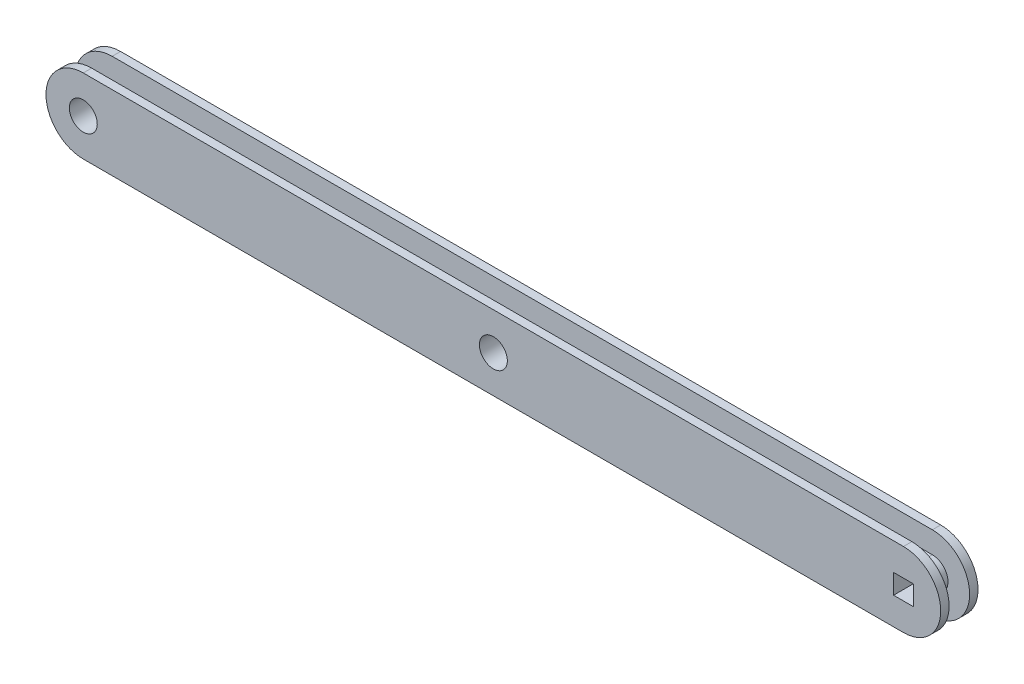
ISO-10303-21;
HEADER;
FILE_DESCRIPTION(('STEP AP214'),'2;1');
FILE_NAME('part.step','',(''),(''),'','','');
FILE_SCHEMA(('AUTOMOTIVE_DESIGN { 1 0 10303 214 1 1 1 1 }'));
ENDSEC;
DATA;
#1=APPLICATION_CONTEXT('core data for automotive mechanical design processes');
#2=APPLICATION_PROTOCOL_DEFINITION('international standard','automotive_design',2000,#1);
#3=PRODUCT_CONTEXT('',#1,'mechanical');
#4=PRODUCT('Part','Part','',(#3));
#5=PRODUCT_RELATED_PRODUCT_CATEGORY('part','',(#4));
#6=PRODUCT_DEFINITION_FORMATION('','',#4);
#7=PRODUCT_DEFINITION_CONTEXT('part definition',#1,'design');
#8=PRODUCT_DEFINITION('design','',#6,#7);
#9=PRODUCT_DEFINITION_SHAPE('','',#8);
#10=(LENGTH_UNIT() NAMED_UNIT(*) SI_UNIT(.MILLI.,.METRE.));
#11=(NAMED_UNIT(*) PLANE_ANGLE_UNIT() SI_UNIT($,.RADIAN.));
#12=(NAMED_UNIT(*) SI_UNIT($,.STERADIAN.) SOLID_ANGLE_UNIT());
#13=UNCERTAINTY_MEASURE_WITH_UNIT(LENGTH_MEASURE(1.E-05),#10,'distance_accuracy_value','');
#14=(GEOMETRIC_REPRESENTATION_CONTEXT(3) GLOBAL_UNCERTAINTY_ASSIGNED_CONTEXT((#13)) GLOBAL_UNIT_ASSIGNED_CONTEXT((#10,
#11,#12)) REPRESENTATION_CONTEXT('',''));
#15=CARTESIAN_POINT('',(0.,0.,0.));
#16=DIRECTION('',(0.,0.,1.));
#17=DIRECTION('',(1.,0.,0.));
#18=AXIS2_PLACEMENT_3D('',#15,#16,#17);
#19=CARTESIAN_POINT('',(0.,0.,-6.35));
#20=DIRECTION('',(0.,-1.,0.));
#21=DIRECTION('',(1.,0.,0.));
#22=AXIS2_PLACEMENT_3D('',#19,#20,#21);
#23=PLANE('',#22);
#24=DIRECTION('',(0.,0.,1.));
#25=VECTOR('',#24,1.);
#26=CARTESIAN_POINT('',(-146.05,0.,-6.35));
#27=LINE('',#26,#25);
#28=CARTESIAN_POINT('',(-146.05,0.,-1.427499939));
#29=VERTEX_POINT('',#28);
#30=CARTESIAN_POINT('',(-146.05,0.,0.));
#31=VERTEX_POINT('',#30);
#32=EDGE_CURVE('E436',#29,#31,#27,.T.);
#33=ORIENTED_EDGE('',*,*,#32,.F.);
#34=DIRECTION('',(1.,0.,0.));
#35=VECTOR('',#34,1.);
#36=CARTESIAN_POINT('',(-152.4,0.,-1.427499939));
#37=LINE('',#36,#35);
#38=CARTESIAN_POINT('',(-6.35000000000005,0.,-1.427499939));
#39=VERTEX_POINT('',#38);
#40=EDGE_CURVE('E420',#29,#39,#37,.T.);
#41=ORIENTED_EDGE('',*,*,#40,.T.);
#42=DIRECTION('',(0.,0.,1.));
#43=VECTOR('',#42,1.);
#44=CARTESIAN_POINT('',(-6.34999999999999,0.,-6.35));
#45=LINE('',#44,#43);
#46=CARTESIAN_POINT('',(-6.34999999999999,0.,0.));
#47=VERTEX_POINT('',#46);
#48=EDGE_CURVE('E451',#39,#47,#45,.T.);
#49=ORIENTED_EDGE('',*,*,#48,.T.);
#50=DIRECTION('',(1.,0.,0.));
#51=VECTOR('',#50,1.);
#52=CARTESIAN_POINT('',(0.,0.,0.));
#53=LINE('',#52,#51);
#54=EDGE_CURVE('E500',#31,#47,#53,.T.);
#55=ORIENTED_EDGE('',*,*,#54,.F.);
#56=EDGE_LOOP('',(#33,#41,#49,#55));
#57=FACE_BOUND('',#56,.T.);
#58=ADVANCED_FACE('F296',(#57),#23,.T.);
#59=CARTESIAN_POINT('',(-6.34999999999999,0.,-6.35));
#60=VERTEX_POINT('',#59);
#61=CARTESIAN_POINT('',(-6.35000000000005,0.,-4.922500061));
#62=VERTEX_POINT('',#61);
#63=EDGE_CURVE('E416',#60,#62,#45,.T.);
#64=ORIENTED_EDGE('',*,*,#63,.T.);
#65=DIRECTION('',(1.,0.,0.));
#66=VECTOR('',#65,1.);
#67=CARTESIAN_POINT('',(-152.4,0.,-4.922500061));
#68=LINE('',#67,#66);
#69=CARTESIAN_POINT('',(-146.05,0.,-4.922500061));
#70=VERTEX_POINT('',#69);
#71=EDGE_CURVE('E409',#70,#62,#68,.T.);
#72=ORIENTED_EDGE('',*,*,#71,.F.);
#73=CARTESIAN_POINT('',(-146.05,0.,-6.35));
#74=VERTEX_POINT('',#73);
#75=EDGE_CURVE('E413',#74,#70,#27,.T.);
#76=ORIENTED_EDGE('',*,*,#75,.F.);
#77=DIRECTION('',(1.,0.,0.));
#78=VECTOR('',#77,1.);
#79=CARTESIAN_POINT('',(0.,0.,-6.35));
#80=LINE('',#79,#78);
#81=EDGE_CURVE('E499',#74,#60,#80,.T.);
#82=ORIENTED_EDGE('',*,*,#81,.T.);
#83=EDGE_LOOP('',(#64,#72,#76,#82));
#84=FACE_BOUND('',#83,.T.);
#85=ADVANCED_FACE('F411',(#84),#23,.T.);
#86=CARTESIAN_POINT('',(-152.4,12.7,-6.35));
#87=DIRECTION('',(0.,1.,0.));
#88=DIRECTION('',(-1.,0.,0.));
#89=AXIS2_PLACEMENT_3D('',#86,#87,#88);
#90=PLANE('',#89);
#91=DIRECTION('',(1.,0.,0.));
#92=VECTOR('',#91,1.);
#93=CARTESIAN_POINT('',(-152.4,12.7,-1.427499939));
#94=LINE('',#93,#92);
#95=CARTESIAN_POINT('',(-146.05,12.7,-1.427499939));
#96=VERTEX_POINT('',#95);
#97=CARTESIAN_POINT('',(-6.35000000000008,12.7,-1.427499939));
#98=VERTEX_POINT('',#97);
#99=EDGE_CURVE('E513',#96,#98,#94,.T.);
#100=ORIENTED_EDGE('',*,*,#99,.F.);
#101=DIRECTION('',(0.,0.,1.));
#102=VECTOR('',#101,1.);
#103=CARTESIAN_POINT('',(-146.05,12.7,-6.35));
#104=LINE('',#103,#102);
#105=CARTESIAN_POINT('',(-146.05,12.7,0.));
#106=VERTEX_POINT('',#105);
#107=EDGE_CURVE('E444',#96,#106,#104,.T.);
#108=ORIENTED_EDGE('',*,*,#107,.T.);
#109=DIRECTION('',(-1.,0.,0.));
#110=VECTOR('',#109,1.);
#111=CARTESIAN_POINT('',(-152.4,12.7,0.));
#112=LINE('',#111,#110);
#113=CARTESIAN_POINT('',(-6.35,12.7,0.));
#114=VERTEX_POINT('',#113);
#115=EDGE_CURVE('E480',#114,#106,#112,.T.);
#116=ORIENTED_EDGE('',*,*,#115,.F.);
#117=DIRECTION('',(0.,0.,1.));
#118=VECTOR('',#117,1.);
#119=CARTESIAN_POINT('',(-6.35,12.7,-6.35));
#120=LINE('',#119,#118);
#121=EDGE_CURVE('E435',#98,#114,#120,.T.);
#122=ORIENTED_EDGE('',*,*,#121,.F.);
#123=EDGE_LOOP('',(#100,#108,#116,#122));
#124=FACE_BOUND('',#123,.T.);
#125=ADVANCED_FACE('F527',(#124),#90,.T.);
#126=CARTESIAN_POINT('',(-6.35,6.34999999999998,-6.35));
#127=DIRECTION('',(0.,0.,1.));
#128=DIRECTION('',(1.,0.,0.));
#129=AXIS2_PLACEMENT_3D('',#126,#127,#128);
#130=CYLINDRICAL_SURFACE('',#129,6.35);
#131=CARTESIAN_POINT('',(-6.35,6.34999999999998,-4.922500061));
#132=DIRECTION('',(0.,0.,1.));
#133=DIRECTION('',(1.,0.,0.));
#134=AXIS2_PLACEMENT_3D('',#131,#132,#133);
#135=CIRCLE('',#134,6.35);
#136=CARTESIAN_POINT('',(-6.35000000000008,12.7,-4.922500061));
#137=VERTEX_POINT('',#136);
#138=EDGE_CURVE('E12',#62,#137,#135,.T.);
#139=ORIENTED_EDGE('',*,*,#138,.F.);
#140=ORIENTED_EDGE('',*,*,#63,.F.);
#141=CARTESIAN_POINT('',(-6.35,6.34999999999998,-6.35));
#142=DIRECTION('',(0.,0.,1.));
#143=DIRECTION('',(1.,0.,0.));
#144=AXIS2_PLACEMENT_3D('',#141,#142,#143);
#145=CIRCLE('',#144,6.35);
#146=CARTESIAN_POINT('',(-6.35,12.7,-6.35));
#147=VERTEX_POINT('',#146);
#148=EDGE_CURVE('E492',#147,#60,#145,.F.);
#149=ORIENTED_EDGE('',*,*,#148,.F.);
#150=EDGE_CURVE('E438',#147,#137,#120,.T.);
#151=ORIENTED_EDGE('',*,*,#150,.T.);
#152=EDGE_LOOP('',(#139,#140,#149,#151));
#153=FACE_BOUND('',#152,.T.);
#154=ADVANCED_FACE('F553',(#153),#130,.T.);
#155=CARTESIAN_POINT('',(-6.35,6.34999999999998,-1.427499939));
#156=DIRECTION('',(0.,0.,-1.));
#157=DIRECTION('',(-1.,0.,0.));
#158=AXIS2_PLACEMENT_3D('',#155,#156,#157);
#159=CIRCLE('',#158,6.35);
#160=EDGE_CURVE('E304',#98,#39,#159,.T.);
#161=ORIENTED_EDGE('',*,*,#160,.F.);
#162=ORIENTED_EDGE('',*,*,#121,.T.);
#163=CARTESIAN_POINT('',(-6.35,6.34999999999998,0.));
#164=DIRECTION('',(0.,0.,1.));
#165=DIRECTION('',(1.,0.,0.));
#166=AXIS2_PLACEMENT_3D('',#163,#164,#165);
#167=CIRCLE('',#166,6.35);
#168=EDGE_CURVE('E490',#114,#47,#167,.F.);
#169=ORIENTED_EDGE('',*,*,#168,.T.);
#170=ORIENTED_EDGE('',*,*,#48,.F.);
#171=EDGE_LOOP('',(#161,#162,#169,#170));
#172=FACE_BOUND('',#171,.T.);
#173=ADVANCED_FACE('F520',(#172),#130,.T.);
#174=CARTESIAN_POINT('',(-146.05,6.34999999999998,-6.35));
#175=DIRECTION('',(0.,0.,1.));
#176=DIRECTION('',(1.,0.,0.));
#177=AXIS2_PLACEMENT_3D('',#174,#175,#176);
#178=CYLINDRICAL_SURFACE('',#177,6.35);
#179=ORIENTED_EDGE('',*,*,#75,.T.);
#180=CARTESIAN_POINT('',(-146.05,6.34999999999998,-4.922500061));
#181=DIRECTION('',(0.,0.,1.));
#182=DIRECTION('',(1.,0.,0.));
#183=AXIS2_PLACEMENT_3D('',#180,#181,#182);
#184=CIRCLE('',#183,6.35);
#185=CARTESIAN_POINT('',(-146.05,12.7,-4.922500061));
#186=VERTEX_POINT('',#185);
#187=EDGE_CURVE('E423',#70,#186,#184,.F.);
#188=ORIENTED_EDGE('',*,*,#187,.T.);
#189=CARTESIAN_POINT('',(-146.05,12.7,-6.35));
#190=VERTEX_POINT('',#189);
#191=EDGE_CURVE('E449',#190,#186,#104,.T.);
#192=ORIENTED_EDGE('',*,*,#191,.F.);
#193=CARTESIAN_POINT('',(-146.05,6.34999999999998,-6.35));
#194=DIRECTION('',(0.,0.,1.));
#195=DIRECTION('',(1.,0.,0.));
#196=AXIS2_PLACEMENT_3D('',#193,#194,#195);
#197=CIRCLE('',#196,6.35);
#198=EDGE_CURVE('E434',#190,#74,#197,.T.);
#199=ORIENTED_EDGE('',*,*,#198,.T.);
#200=EDGE_LOOP('',(#179,#188,#192,#199));
#201=FACE_BOUND('',#200,.T.);
#202=ADVANCED_FACE('F432',(#201),#178,.T.);
#203=ORIENTED_EDGE('',*,*,#107,.F.);
#204=CARTESIAN_POINT('',(-146.05,6.34999999999998,-1.427499939));
#205=DIRECTION('',(0.,0.,-1.));
#206=DIRECTION('',(-1.,0.,0.));
#207=AXIS2_PLACEMENT_3D('',#204,#205,#206);
#208=CIRCLE('',#207,6.35);
#209=EDGE_CURVE('E430',#96,#29,#208,.F.);
#210=ORIENTED_EDGE('',*,*,#209,.T.);
#211=ORIENTED_EDGE('',*,*,#32,.T.);
#212=CARTESIAN_POINT('',(-146.05,6.34999999999998,0.));
#213=DIRECTION('',(0.,0.,1.));
#214=DIRECTION('',(1.,0.,0.));
#215=AXIS2_PLACEMENT_3D('',#212,#213,#214);
#216=CIRCLE('',#215,6.35);
#217=EDGE_CURVE('E445',#106,#31,#216,.T.);
#218=ORIENTED_EDGE('',*,*,#217,.F.);
#219=EDGE_LOOP('',(#203,#210,#211,#218));
#220=FACE_BOUND('',#219,.T.);
#221=ADVANCED_FACE('F530',(#220),#178,.T.);
#222=DIRECTION('',(1.,0.,0.));
#223=VECTOR('',#222,1.);
#224=CARTESIAN_POINT('',(-152.4,12.7,-4.922500061));
#225=LINE('',#224,#223);
#226=EDGE_CURVE('E426',#186,#137,#225,.T.);
#227=ORIENTED_EDGE('',*,*,#226,.T.);
#228=ORIENTED_EDGE('',*,*,#150,.F.);
#229=DIRECTION('',(-1.,0.,0.));
#230=VECTOR('',#229,1.);
#231=CARTESIAN_POINT('',(-152.4,12.7,-6.35));
#232=LINE('',#231,#230);
#233=EDGE_CURVE('E497',#147,#190,#232,.T.);
#234=ORIENTED_EDGE('',*,*,#233,.T.);
#235=ORIENTED_EDGE('',*,*,#191,.T.);
#236=EDGE_LOOP('',(#227,#228,#234,#235));
#237=FACE_BOUND('',#236,.T.);
#238=ADVANCED_FACE('F298',(#237),#90,.T.);
#239=CARTESIAN_POINT('',(0.,0.,-6.35));
#240=DIRECTION('',(0.,0.,-1.));
#241=DIRECTION('',(-1.,0.,0.));
#242=AXIS2_PLACEMENT_3D('',#239,#240,#241);
#243=PLANE('',#242);
#244=ORIENTED_EDGE('',*,*,#233,.F.);
#245=ORIENTED_EDGE('',*,*,#148,.T.);
#246=ORIENTED_EDGE('',*,*,#81,.F.);
#247=ORIENTED_EDGE('',*,*,#198,.F.);
#248=EDGE_LOOP('',(#244,#245,#246,#247));
#249=FACE_BOUND('',#248,.T.);
#250=CARTESIAN_POINT('',(-76.2,6.34999999999998,-6.35));
#251=DIRECTION('',(0.,0.,1.));
#252=DIRECTION('',(1.,0.,0.));
#253=AXIS2_PLACEMENT_3D('',#250,#251,#252);
#254=CIRCLE('',#253,2.38125000000001);
#255=CARTESIAN_POINT('',(-73.81875,6.34999999999998,-6.35));
#256=VERTEX_POINT('',#255);
#257=EDGE_CURVE('E487',#256,#256,#254,.T.);
#258=ORIENTED_EDGE('',*,*,#257,.T.);
#259=EDGE_LOOP('',(#258));
#260=FACE_BOUND('',#259,.T.);
#261=CARTESIAN_POINT('',(-146.05,6.34999999999998,-6.35));
#262=DIRECTION('',(0.,0.,1.));
#263=DIRECTION('',(1.,0.,0.));
#264=AXIS2_PLACEMENT_3D('',#261,#262,#263);
#265=CIRCLE('',#264,2.38125000000001);
#266=CARTESIAN_POINT('',(-143.66875,6.34999999999998,-6.35));
#267=VERTEX_POINT('',#266);
#268=EDGE_CURVE('E477',#267,#267,#265,.T.);
#269=ORIENTED_EDGE('',*,*,#268,.T.);
#270=EDGE_LOOP('',(#269));
#271=FACE_BOUND('',#270,.T.);
#272=DIRECTION('',(1.,0.,0.));
#273=VECTOR('',#272,1.);
#274=CARTESIAN_POINT('',(0.,8.03379802270045,-6.35));
#275=LINE('',#274,#273);
#276=CARTESIAN_POINT('',(-8.03379802270047,8.03379802270045,-6.35));
#277=VERTEX_POINT('',#276);
#278=CARTESIAN_POINT('',(-4.66620197729953,8.03379802270045,-6.35));
#279=VERTEX_POINT('',#278);
#280=EDGE_CURVE('E472',#277,#279,#275,.T.);
#281=ORIENTED_EDGE('',*,*,#280,.F.);
#282=DIRECTION('',(0.,1.,0.));
#283=VECTOR('',#282,1.);
#284=CARTESIAN_POINT('',(-8.03379802270047,0.,-6.35));
#285=LINE('',#284,#283);
#286=CARTESIAN_POINT('',(-8.03379802270047,4.66620197729952,-6.35));
#287=VERTEX_POINT('',#286);
#288=EDGE_CURVE('E454',#287,#277,#285,.T.);
#289=ORIENTED_EDGE('',*,*,#288,.F.);
#290=DIRECTION('',(1.,0.,0.));
#291=VECTOR('',#290,1.);
#292=CARTESIAN_POINT('',(0.,4.66620197729952,-6.35));
#293=LINE('',#292,#291);
#294=CARTESIAN_POINT('',(-4.66620197729953,4.66620197729952,-6.35));
#295=VERTEX_POINT('',#294);
#296=EDGE_CURVE('E463',#287,#295,#293,.T.);
#297=ORIENTED_EDGE('',*,*,#296,.T.);
#298=DIRECTION('',(0.,1.,0.));
#299=VECTOR('',#298,1.);
#300=CARTESIAN_POINT('',(-4.66620197729953,0.,-6.35));
#301=LINE('',#300,#299);
#302=EDGE_CURVE('E311',#295,#279,#301,.T.);
#303=ORIENTED_EDGE('',*,*,#302,.T.);
#304=EDGE_LOOP('',(#281,#289,#297,#303));
#305=FACE_BOUND('',#304,.T.);
#306=ADVANCED_FACE('F537',(#249,#260,#271,#305),#243,.T.);
#307=CARTESIAN_POINT('',(0.,0.,0.));
#308=DIRECTION('',(0.,0.,-1.));
#309=DIRECTION('',(-1.,0.,0.));
#310=AXIS2_PLACEMENT_3D('',#307,#308,#309);
#311=PLANE('',#310);
#312=DIRECTION('',(0.,1.,0.));
#313=VECTOR('',#312,1.);
#314=CARTESIAN_POINT('',(-8.03379802270047,0.,0.));
#315=LINE('',#314,#313);
#316=CARTESIAN_POINT('',(-8.03379802270047,4.66620197729952,0.));
#317=VERTEX_POINT('',#316);
#318=CARTESIAN_POINT('',(-8.03379802270047,8.03379802270045,0.));
#319=VERTEX_POINT('',#318);
#320=EDGE_CURVE('E319',#317,#319,#315,.T.);
#321=ORIENTED_EDGE('',*,*,#320,.T.);
#322=DIRECTION('',(1.,0.,0.));
#323=VECTOR('',#322,1.);
#324=CARTESIAN_POINT('',(0.,8.03379802270045,0.));
#325=LINE('',#324,#323);
#326=CARTESIAN_POINT('',(-4.66620197729953,8.03379802270045,0.));
#327=VERTEX_POINT('',#326);
#328=EDGE_CURVE('E462',#319,#327,#325,.T.);
#329=ORIENTED_EDGE('',*,*,#328,.T.);
#330=DIRECTION('',(0.,1.,0.));
#331=VECTOR('',#330,1.);
#332=CARTESIAN_POINT('',(-4.66620197729953,0.,0.));
#333=LINE('',#332,#331);
#334=CARTESIAN_POINT('',(-4.66620197729953,4.66620197729952,0.));
#335=VERTEX_POINT('',#334);
#336=EDGE_CURVE('E466',#335,#327,#333,.T.);
#337=ORIENTED_EDGE('',*,*,#336,.F.);
#338=DIRECTION('',(1.,0.,0.));
#339=VECTOR('',#338,1.);
#340=CARTESIAN_POINT('',(0.,4.66620197729952,0.));
#341=LINE('',#340,#339);
#342=EDGE_CURVE('E448',#317,#335,#341,.T.);
#343=ORIENTED_EDGE('',*,*,#342,.F.);
#344=EDGE_LOOP('',(#321,#329,#337,#343));
#345=FACE_BOUND('',#344,.T.);
#346=CARTESIAN_POINT('',(-146.05,6.34999999999998,0.));
#347=DIRECTION('',(0.,0.,1.));
#348=DIRECTION('',(1.,0.,0.));
#349=AXIS2_PLACEMENT_3D('',#346,#347,#348);
#350=CIRCLE('',#349,2.38125000000001);
#351=CARTESIAN_POINT('',(-143.66875,6.34999999999998,0.));
#352=VERTEX_POINT('',#351);
#353=EDGE_CURVE('E481',#352,#352,#350,.T.);
#354=ORIENTED_EDGE('',*,*,#353,.F.);
#355=EDGE_LOOP('',(#354));
#356=FACE_BOUND('',#355,.T.);
#357=CARTESIAN_POINT('',(-76.2,6.34999999999998,0.));
#358=DIRECTION('',(0.,0.,1.));
#359=DIRECTION('',(1.,0.,0.));
#360=AXIS2_PLACEMENT_3D('',#357,#358,#359);
#361=CIRCLE('',#360,2.38125000000001);
#362=CARTESIAN_POINT('',(-73.81875,6.34999999999998,0.));
#363=VERTEX_POINT('',#362);
#364=EDGE_CURVE('E484',#363,#363,#361,.T.);
#365=ORIENTED_EDGE('',*,*,#364,.F.);
#366=EDGE_LOOP('',(#365));
#367=FACE_BOUND('',#366,.T.);
#368=ORIENTED_EDGE('',*,*,#168,.F.);
#369=ORIENTED_EDGE('',*,*,#115,.T.);
#370=ORIENTED_EDGE('',*,*,#217,.T.);
#371=ORIENTED_EDGE('',*,*,#54,.T.);
#372=EDGE_LOOP('',(#368,#369,#370,#371));
#373=FACE_BOUND('',#372,.T.);
#374=ADVANCED_FACE('F524',(#345,#356,#367,#373),#311,.F.);
#375=CARTESIAN_POINT('',(-146.05,6.34999999999998,-6.35));
#376=DIRECTION('',(0.,0.,1.));
#377=DIRECTION('',(1.,0.,0.));
#378=AXIS2_PLACEMENT_3D('',#375,#376,#377);
#379=CYLINDRICAL_SURFACE('',#378,2.38125000000001);
#380=ORIENTED_EDGE('',*,*,#268,.F.);
#381=EDGE_LOOP('',(#380));
#382=FACE_BOUND('',#381,.T.);
#383=ORIENTED_EDGE('',*,*,#353,.T.);
#384=EDGE_LOOP('',(#383));
#385=FACE_BOUND('',#384,.T.);
#386=ADVANCED_FACE('F548',(#382,#385),#379,.F.);
#387=CARTESIAN_POINT('',(-76.2,6.34999999999998,-6.35));
#388=DIRECTION('',(0.,0.,1.));
#389=DIRECTION('',(1.,0.,0.));
#390=AXIS2_PLACEMENT_3D('',#387,#388,#389);
#391=CYLINDRICAL_SURFACE('',#390,2.38125000000001);
#392=ORIENTED_EDGE('',*,*,#257,.F.);
#393=EDGE_LOOP('',(#392));
#394=FACE_BOUND('',#393,.T.);
#395=ORIENTED_EDGE('',*,*,#364,.T.);
#396=EDGE_LOOP('',(#395));
#397=FACE_BOUND('',#396,.T.);
#398=ADVANCED_FACE('F557',(#394,#397),#391,.F.);
#399=CARTESIAN_POINT('',(-8.03379802270047,0.,-6.35));
#400=DIRECTION('',(1.,0.,0.));
#401=DIRECTION('',(0.,0.,-1.));
#402=AXIS2_PLACEMENT_3D('',#399,#400,#401);
#403=PLANE('',#402);
#404=ORIENTED_EDGE('',*,*,#320,.F.);
#405=DIRECTION('',(0.,0.,1.));
#406=VECTOR('',#405,1.);
#407=CARTESIAN_POINT('',(-8.03379802270047,4.66620197729952,-6.35));
#408=LINE('',#407,#406);
#409=EDGE_CURVE('E459',#287,#317,#408,.T.);
#410=ORIENTED_EDGE('',*,*,#409,.F.);
#411=ORIENTED_EDGE('',*,*,#288,.T.);
#412=DIRECTION('',(0.,0.,1.));
#413=VECTOR('',#412,1.);
#414=CARTESIAN_POINT('',(-8.03379802270047,8.03379802270045,-6.35));
#415=LINE('',#414,#413);
#416=EDGE_CURVE('E457',#277,#319,#415,.T.);
#417=ORIENTED_EDGE('',*,*,#416,.T.);
#418=EDGE_LOOP('',(#404,#410,#411,#417));
#419=FACE_BOUND('',#418,.T.);
#420=ADVANCED_FACE('F560',(#419),#403,.T.);
#421=CARTESIAN_POINT('',(0.,8.03379802270045,-6.35));
#422=DIRECTION('',(0.,-1.,0.));
#423=DIRECTION('',(0.,0.,-1.));
#424=AXIS2_PLACEMENT_3D('',#421,#422,#423);
#425=PLANE('',#424);
#426=ORIENTED_EDGE('',*,*,#328,.F.);
#427=ORIENTED_EDGE('',*,*,#416,.F.);
#428=ORIENTED_EDGE('',*,*,#280,.T.);
#429=DIRECTION('',(0.,0.,1.));
#430=VECTOR('',#429,1.);
#431=CARTESIAN_POINT('',(-4.66620197729953,8.03379802270045,-6.35));
#432=LINE('',#431,#430);
#433=EDGE_CURVE('E455',#279,#327,#432,.T.);
#434=ORIENTED_EDGE('',*,*,#433,.T.);
#435=EDGE_LOOP('',(#426,#427,#428,#434));
#436=FACE_BOUND('',#435,.T.);
#437=ADVANCED_FACE('F567',(#436),#425,.T.);
#438=CARTESIAN_POINT('',(-4.66620197729953,0.,-6.35));
#439=DIRECTION('',(1.,0.,0.));
#440=DIRECTION('',(0.,0.,-1.));
#441=AXIS2_PLACEMENT_3D('',#438,#439,#440);
#442=PLANE('',#441);
#443=ORIENTED_EDGE('',*,*,#336,.T.);
#444=ORIENTED_EDGE('',*,*,#433,.F.);
#445=ORIENTED_EDGE('',*,*,#302,.F.);
#446=DIRECTION('',(0.,0.,1.));
#447=VECTOR('',#446,1.);
#448=CARTESIAN_POINT('',(-4.66620197729953,4.66620197729952,-6.35));
#449=LINE('',#448,#447);
#450=EDGE_CURVE('E452',#295,#335,#449,.T.);
#451=ORIENTED_EDGE('',*,*,#450,.T.);
#452=EDGE_LOOP('',(#443,#444,#445,#451));
#453=FACE_BOUND('',#452,.T.);
#454=ADVANCED_FACE('F570',(#453),#442,.F.);
#455=CARTESIAN_POINT('',(0.,4.66620197729952,-6.35));
#456=DIRECTION('',(0.,-1.,0.));
#457=DIRECTION('',(0.,0.,-1.));
#458=AXIS2_PLACEMENT_3D('',#455,#456,#457);
#459=PLANE('',#458);
#460=ORIENTED_EDGE('',*,*,#342,.T.);
#461=ORIENTED_EDGE('',*,*,#450,.F.);
#462=ORIENTED_EDGE('',*,*,#296,.F.);
#463=ORIENTED_EDGE('',*,*,#409,.T.);
#464=EDGE_LOOP('',(#460,#461,#462,#463));
#465=FACE_BOUND('',#464,.T.);
#466=ADVANCED_FACE('F573',(#465),#459,.F.);
#467=CARTESIAN_POINT('',(-146.050000000001,152.4,-4.922500061));
#468=DIRECTION('',(0.,0.,1.));
#469=DIRECTION('',(1.,0.,0.));
#470=AXIS2_PLACEMENT_3D('',#467,#468,#469);
#471=PLANE('',#470);
#472=DIRECTION('',(1.,0.,0.));
#473=VECTOR('',#472,1.);
#474=CARTESIAN_POINT('',(-152.4,3.68299999999997,-4.922500061));
#475=LINE('',#474,#473);
#476=CARTESIAN_POINT('',(-146.05,3.68299999999997,-4.922500061));
#477=VERTEX_POINT('',#476);
#478=CARTESIAN_POINT('',(-6.34999999999999,3.68299999999997,-4.922500061));
#479=VERTEX_POINT('',#478);
#480=EDGE_CURVE('E419',#477,#479,#475,.T.);
#481=ORIENTED_EDGE('',*,*,#480,.F.);
#482=CARTESIAN_POINT('',(-146.05,6.34999999999999,-4.922500061));
#483=DIRECTION('',(0.,0.,-1.));
#484=DIRECTION('',(-1.,0.,0.));
#485=AXIS2_PLACEMENT_3D('',#482,#483,#484);
#486=CIRCLE('',#485,2.66700000000001);
#487=CARTESIAN_POINT('',(-146.05,9.017,-4.922500061));
#488=VERTEX_POINT('',#487);
#489=EDGE_CURVE('E615',#477,#488,#486,.T.);
#490=ORIENTED_EDGE('',*,*,#489,.T.);
#491=DIRECTION('',(1.,0.,0.));
#492=VECTOR('',#491,1.);
#493=CARTESIAN_POINT('',(-152.4,9.017,-4.922500061));
#494=LINE('',#493,#492);
#495=CARTESIAN_POINT('',(-6.35000000000005,9.017,-4.922500061));
#496=VERTEX_POINT('',#495);
#497=EDGE_CURVE('E637',#488,#496,#494,.T.);
#498=ORIENTED_EDGE('',*,*,#497,.T.);
#499=CARTESIAN_POINT('',(-6.34999999999999,6.34999999999999,-4.922500061));
#500=DIRECTION('',(0.,0.,1.));
#501=DIRECTION('',(1.,0.,0.));
#502=AXIS2_PLACEMENT_3D('',#499,#500,#501);
#503=CIRCLE('',#502,2.66700000000001);
#504=EDGE_CURVE('E627',#479,#496,#503,.T.);
#505=ORIENTED_EDGE('',*,*,#504,.F.);
#506=EDGE_LOOP('',(#481,#490,#498,#505));
#507=FACE_BOUND('',#506,.T.);
#508=ORIENTED_EDGE('',*,*,#138,.T.);
#509=ORIENTED_EDGE('',*,*,#226,.F.);
#510=ORIENTED_EDGE('',*,*,#187,.F.);
#511=ORIENTED_EDGE('',*,*,#71,.T.);
#512=EDGE_LOOP('',(#508,#509,#510,#511));
#513=FACE_BOUND('',#512,.T.);
#514=ADVANCED_FACE('F424',(#507,#513),#471,.T.);
#515=CARTESIAN_POINT('',(-146.050000000001,152.4,-1.427499939));
#516=DIRECTION('',(0.,0.,-1.));
#517=DIRECTION('',(-1.,0.,0.));
#518=AXIS2_PLACEMENT_3D('',#515,#516,#517);
#519=PLANE('',#518);
#520=DIRECTION('',(1.,0.,0.));
#521=VECTOR('',#520,1.);
#522=CARTESIAN_POINT('',(-152.4,3.68299999999997,-1.427499939));
#523=LINE('',#522,#521);
#524=CARTESIAN_POINT('',(-146.05,3.68299999999997,-1.427499939));
#525=VERTEX_POINT('',#524);
#526=CARTESIAN_POINT('',(-6.35000000000005,3.68299999999999,-1.427499939));
#527=VERTEX_POINT('',#526);
#528=EDGE_CURVE('E638',#525,#527,#523,.T.);
#529=ORIENTED_EDGE('',*,*,#528,.T.);
#530=CARTESIAN_POINT('',(-6.34999999999999,6.34999999999999,-1.427499939));
#531=DIRECTION('',(0.,0.,1.));
#532=DIRECTION('',(1.,0.,0.));
#533=AXIS2_PLACEMENT_3D('',#530,#531,#532);
#534=CIRCLE('',#533,2.66700000000001);
#535=CARTESIAN_POINT('',(-6.34999999999999,9.017,-1.427499939));
#536=VERTEX_POINT('',#535);
#537=EDGE_CURVE('E624',#527,#536,#534,.T.);
#538=ORIENTED_EDGE('',*,*,#537,.T.);
#539=DIRECTION('',(1.,0.,0.));
#540=VECTOR('',#539,1.);
#541=CARTESIAN_POINT('',(-152.4,9.017,-1.427499939));
#542=LINE('',#541,#540);
#543=CARTESIAN_POINT('',(-146.05,9.017,-1.427499939));
#544=VERTEX_POINT('',#543);
#545=EDGE_CURVE('E635',#544,#536,#542,.T.);
#546=ORIENTED_EDGE('',*,*,#545,.F.);
#547=CARTESIAN_POINT('',(-146.05,6.34999999999999,-1.427499939));
#548=DIRECTION('',(0.,0.,-1.));
#549=DIRECTION('',(-1.,0.,0.));
#550=AXIS2_PLACEMENT_3D('',#547,#548,#549);
#551=CIRCLE('',#550,2.66700000000001);
#552=EDGE_CURVE('E440',#525,#544,#551,.T.);
#553=ORIENTED_EDGE('',*,*,#552,.F.);
#554=EDGE_LOOP('',(#529,#538,#546,#553));
#555=FACE_BOUND('',#554,.T.);
#556=ORIENTED_EDGE('',*,*,#40,.F.);
#557=ORIENTED_EDGE('',*,*,#209,.F.);
#558=ORIENTED_EDGE('',*,*,#99,.T.);
#559=ORIENTED_EDGE('',*,*,#160,.T.);
#560=EDGE_LOOP('',(#556,#557,#558,#559));
#561=FACE_BOUND('',#560,.T.);
#562=ADVANCED_FACE('F510',(#555,#561),#519,.T.);
#563=CARTESIAN_POINT('',(-146.05,6.34999999999999,-6.35));
#564=DIRECTION('',(0.,0.,-1.));
#565=DIRECTION('',(-1.,0.,0.));
#566=AXIS2_PLACEMENT_3D('',#563,#564,#565);
#567=CYLINDRICAL_SURFACE('',#566,2.66700000000001);
#568=ORIENTED_EDGE('',*,*,#489,.F.);
#569=DIRECTION('',(0.,0.,1.));
#570=VECTOR('',#569,1.);
#571=CARTESIAN_POINT('',(-146.05,3.68299999999997,0.));
#572=LINE('',#571,#570);
#573=EDGE_CURVE('E617',#477,#525,#572,.T.);
#574=ORIENTED_EDGE('',*,*,#573,.T.);
#575=ORIENTED_EDGE('',*,*,#552,.T.);
#576=DIRECTION('',(0.,0.,1.));
#577=VECTOR('',#576,1.);
#578=CARTESIAN_POINT('',(-146.05,9.017,0.));
#579=LINE('',#578,#577);
#580=EDGE_CURVE('E618',#488,#544,#579,.T.);
#581=ORIENTED_EDGE('',*,*,#580,.F.);
#582=EDGE_LOOP('',(#568,#574,#575,#581));
#583=FACE_BOUND('',#582,.T.);
#584=ADVANCED_FACE('F598',(#583),#567,.T.);
#585=CARTESIAN_POINT('',(-6.34999999999999,6.34999999999999,-6.35));
#586=DIRECTION('',(0.,0.,-1.));
#587=DIRECTION('',(1.,0.,0.));
#588=AXIS2_PLACEMENT_3D('',#585,#586,#587);
#589=CYLINDRICAL_SURFACE('',#588,2.66700000000001);
#590=ORIENTED_EDGE('',*,*,#504,.T.);
#591=DIRECTION('',(0.,0.,1.));
#592=VECTOR('',#591,1.);
#593=CARTESIAN_POINT('',(-6.34999999999999,9.017,0.));
#594=LINE('',#593,#592);
#595=EDGE_CURVE('E632',#496,#536,#594,.T.);
#596=ORIENTED_EDGE('',*,*,#595,.T.);
#597=ORIENTED_EDGE('',*,*,#537,.F.);
#598=DIRECTION('',(0.,0.,1.));
#599=VECTOR('',#598,1.);
#600=CARTESIAN_POINT('',(-6.34999999999999,3.68299999999997,0.));
#601=LINE('',#600,#599);
#602=EDGE_CURVE('E630',#479,#527,#601,.T.);
#603=ORIENTED_EDGE('',*,*,#602,.F.);
#604=EDGE_LOOP('',(#590,#596,#597,#603));
#605=FACE_BOUND('',#604,.T.);
#606=ADVANCED_FACE('F604',(#605),#589,.T.);
#607=CARTESIAN_POINT('',(-152.4,9.017,-1.427499939));
#608=DIRECTION('',(0.,-1.,0.));
#609=DIRECTION('',(0.,0.,-1.));
#610=AXIS2_PLACEMENT_3D('',#607,#608,#609);
#611=PLANE('',#610);
#612=ORIENTED_EDGE('',*,*,#580,.T.);
#613=ORIENTED_EDGE('',*,*,#545,.T.);
#614=ORIENTED_EDGE('',*,*,#595,.F.);
#615=ORIENTED_EDGE('',*,*,#497,.F.);
#616=EDGE_LOOP('',(#612,#613,#614,#615));
#617=FACE_BOUND('',#616,.T.);
#618=ADVANCED_FACE('F609',(#617),#611,.F.);
#619=CARTESIAN_POINT('',(-152.4,3.68299999999997,-1.427499939));
#620=DIRECTION('',(0.,-1.,0.));
#621=DIRECTION('',(1.,0.,0.));
#622=AXIS2_PLACEMENT_3D('',#619,#620,#621);
#623=PLANE('',#622);
#624=ORIENTED_EDGE('',*,*,#480,.T.);
#625=ORIENTED_EDGE('',*,*,#602,.T.);
#626=ORIENTED_EDGE('',*,*,#528,.F.);
#627=ORIENTED_EDGE('',*,*,#573,.F.);
#628=EDGE_LOOP('',(#624,#625,#626,#627));
#629=FACE_BOUND('',#628,.T.);
#630=ADVANCED_FACE('F651',(#629),#623,.T.);
#631=CLOSED_SHELL('',(#58,#85,#125,#154,#173,#202,#221,#238,#306,#374,#386,#398,#420,#437,#454,
#466,#514,#562,#584,#606,#618,#630));
#632=MANIFOLD_SOLID_BREP('B2',#631);
#633=ADVANCED_BREP_SHAPE_REPRESENTATION('',(#18,#632),#14);
#634=SHAPE_DEFINITION_REPRESENTATION(#9,#633);
ENDSEC;
END-ISO-10303-21;
